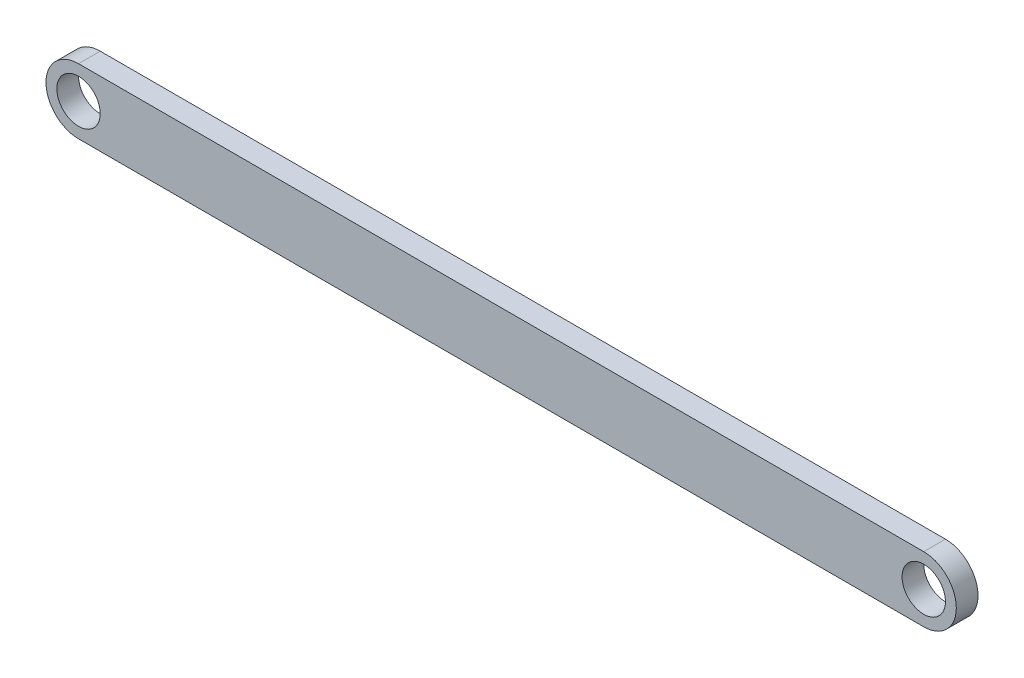
ISO-10303-21;
HEADER;
FILE_DESCRIPTION(('STEP AP214'),'2;1');
FILE_NAME('part.step','',(''),(''),'','','');
FILE_SCHEMA(('AUTOMOTIVE_DESIGN { 1 0 10303 214 1 1 1 1 }'));
ENDSEC;
DATA;
#1=APPLICATION_CONTEXT('core data for automotive mechanical design processes');
#2=APPLICATION_PROTOCOL_DEFINITION('international standard','automotive_design',2000,#1);
#3=PRODUCT_CONTEXT('',#1,'mechanical');
#4=PRODUCT('Part','Part','',(#3));
#5=PRODUCT_RELATED_PRODUCT_CATEGORY('part','',(#4));
#6=PRODUCT_DEFINITION_FORMATION('','',#4);
#7=PRODUCT_DEFINITION_CONTEXT('part definition',#1,'design');
#8=PRODUCT_DEFINITION('design','',#6,#7);
#9=PRODUCT_DEFINITION_SHAPE('','',#8);
#10=(LENGTH_UNIT() NAMED_UNIT(*) SI_UNIT(.MILLI.,.METRE.));
#11=(NAMED_UNIT(*) PLANE_ANGLE_UNIT() SI_UNIT($,.RADIAN.));
#12=(NAMED_UNIT(*) SI_UNIT($,.STERADIAN.) SOLID_ANGLE_UNIT());
#13=UNCERTAINTY_MEASURE_WITH_UNIT(LENGTH_MEASURE(1.E-05),#10,'distance_accuracy_value','');
#14=(GEOMETRIC_REPRESENTATION_CONTEXT(3) GLOBAL_UNCERTAINTY_ASSIGNED_CONTEXT((#13)) GLOBAL_UNIT_ASSIGNED_CONTEXT((#10,
#11,#12)) REPRESENTATION_CONTEXT('',''));
#15=CARTESIAN_POINT('',(0.,0.,0.));
#16=DIRECTION('',(0.,0.,1.));
#17=DIRECTION('',(1.,0.,0.));
#18=AXIS2_PLACEMENT_3D('',#15,#16,#17);
#19=CARTESIAN_POINT('',(0.,0.,0.5));
#20=DIRECTION('',(0.,0.,1.));
#21=DIRECTION('',(1.,0.,0.));
#22=AXIS2_PLACEMENT_3D('',#19,#20,#21);
#23=PLANE('',#22);
#24=CARTESIAN_POINT('',(-38.95,0.,0.5));
#25=DIRECTION('',(0.,0.,1.));
#26=DIRECTION('',(1.,0.,0.));
#27=AXIS2_PLACEMENT_3D('',#24,#25,#26);
#28=CIRCLE('',#27,0.999999999999998);
#29=CARTESIAN_POINT('',(-37.95,0.,0.5));
#30=VERTEX_POINT('',#29);
#31=EDGE_CURVE('E101',#30,#30,#28,.T.);
#32=ORIENTED_EDGE('',*,*,#31,.F.);
#33=EDGE_LOOP('',(#32));
#34=FACE_BOUND('',#33,.T.);
#35=CARTESIAN_POINT('',(0.,0.,0.5));
#36=DIRECTION('',(0.,0.,1.));
#37=DIRECTION('',(1.,0.,0.));
#38=AXIS2_PLACEMENT_3D('',#35,#36,#37);
#39=CIRCLE('',#38,1.5);
#40=CARTESIAN_POINT('',(0.,-1.5,0.5));
#41=VERTEX_POINT('',#40);
#42=CARTESIAN_POINT('',(0.,1.5,0.5));
#43=VERTEX_POINT('',#42);
#44=EDGE_CURVE('E86',#41,#43,#39,.T.);
#45=ORIENTED_EDGE('',*,*,#44,.T.);
#46=DIRECTION('',(-1.,0.,0.));
#47=VECTOR('',#46,1.);
#48=CARTESIAN_POINT('',(0.,1.5,0.5));
#49=LINE('',#48,#47);
#50=CARTESIAN_POINT('',(-38.95,1.5,0.5));
#51=VERTEX_POINT('',#50);
#52=EDGE_CURVE('E81',#43,#51,#49,.T.);
#53=ORIENTED_EDGE('',*,*,#52,.T.);
#54=CARTESIAN_POINT('',(-38.95,0.,0.5));
#55=DIRECTION('',(0.,0.,1.));
#56=DIRECTION('',(1.,0.,0.));
#57=AXIS2_PLACEMENT_3D('',#54,#55,#56);
#58=CIRCLE('',#57,1.5);
#59=CARTESIAN_POINT('',(-38.95,-1.5,0.5));
#60=VERTEX_POINT('',#59);
#61=EDGE_CURVE('E84',#51,#60,#58,.T.);
#62=ORIENTED_EDGE('',*,*,#61,.T.);
#63=DIRECTION('',(1.,0.,0.));
#64=VECTOR('',#63,1.);
#65=CARTESIAN_POINT('',(0.,-1.5,0.5));
#66=LINE('',#65,#64);
#67=EDGE_CURVE('E51',#60,#41,#66,.T.);
#68=ORIENTED_EDGE('',*,*,#67,.T.);
#69=EDGE_LOOP('',(#45,#53,#62,#68));
#70=FACE_BOUND('',#69,.T.);
#71=CARTESIAN_POINT('',(0.,0.,0.5));
#72=DIRECTION('',(0.,0.,1.));
#73=DIRECTION('',(1.,0.,0.));
#74=AXIS2_PLACEMENT_3D('',#71,#72,#73);
#75=CIRCLE('',#74,1.);
#76=CARTESIAN_POINT('',(1.,0.,0.5));
#77=VERTEX_POINT('',#76);
#78=EDGE_CURVE('E116',#77,#77,#75,.T.);
#79=ORIENTED_EDGE('',*,*,#78,.F.);
#80=EDGE_LOOP('',(#79));
#81=FACE_BOUND('',#80,.T.);
#82=ADVANCED_FACE('F34',(#34,#70,#81),#23,.T.);
#83=CARTESIAN_POINT('',(0.,0.,-0.5));
#84=DIRECTION('',(0.,0.,1.));
#85=DIRECTION('',(1.,0.,0.));
#86=AXIS2_PLACEMENT_3D('',#83,#84,#85);
#87=PLANE('',#86);
#88=CARTESIAN_POINT('',(0.,0.,-0.5));
#89=DIRECTION('',(0.,0.,1.));
#90=DIRECTION('',(1.,0.,0.));
#91=AXIS2_PLACEMENT_3D('',#88,#89,#90);
#92=CIRCLE('',#91,1.5);
#93=CARTESIAN_POINT('',(0.,-1.5,-0.5));
#94=VERTEX_POINT('',#93);
#95=CARTESIAN_POINT('',(0.,1.5,-0.5));
#96=VERTEX_POINT('',#95);
#97=EDGE_CURVE('E98',#94,#96,#92,.T.);
#98=ORIENTED_EDGE('',*,*,#97,.F.);
#99=DIRECTION('',(1.,0.,0.));
#100=VECTOR('',#99,1.);
#101=CARTESIAN_POINT('',(0.,-1.5,-0.5));
#102=LINE('',#101,#100);
#103=CARTESIAN_POINT('',(-38.95,-1.5,-0.5));
#104=VERTEX_POINT('',#103);
#105=EDGE_CURVE('E74',#104,#94,#102,.T.);
#106=ORIENTED_EDGE('',*,*,#105,.F.);
#107=CARTESIAN_POINT('',(-38.95,0.,-0.5));
#108=DIRECTION('',(0.,0.,1.));
#109=DIRECTION('',(1.,0.,0.));
#110=AXIS2_PLACEMENT_3D('',#107,#108,#109);
#111=CIRCLE('',#110,1.5);
#112=CARTESIAN_POINT('',(-38.95,1.5,-0.5));
#113=VERTEX_POINT('',#112);
#114=EDGE_CURVE('E68',#113,#104,#111,.T.);
#115=ORIENTED_EDGE('',*,*,#114,.F.);
#116=DIRECTION('',(-1.,0.,0.));
#117=VECTOR('',#116,1.);
#118=CARTESIAN_POINT('',(0.,1.5,-0.5));
#119=LINE('',#118,#117);
#120=EDGE_CURVE('E90',#96,#113,#119,.T.);
#121=ORIENTED_EDGE('',*,*,#120,.F.);
#122=EDGE_LOOP('',(#98,#106,#115,#121));
#123=FACE_BOUND('',#122,.T.);
#124=CARTESIAN_POINT('',(-38.95,0.,-0.5));
#125=DIRECTION('',(0.,0.,1.));
#126=DIRECTION('',(1.,0.,0.));
#127=AXIS2_PLACEMENT_3D('',#124,#125,#126);
#128=CIRCLE('',#127,0.999999999999998);
#129=CARTESIAN_POINT('',(-37.95,0.,-0.5));
#130=VERTEX_POINT('',#129);
#131=EDGE_CURVE('E113',#130,#130,#128,.T.);
#132=ORIENTED_EDGE('',*,*,#131,.T.);
#133=EDGE_LOOP('',(#132));
#134=FACE_BOUND('',#133,.T.);
#135=CARTESIAN_POINT('',(0.,0.,-0.5));
#136=DIRECTION('',(0.,0.,1.));
#137=DIRECTION('',(1.,0.,0.));
#138=AXIS2_PLACEMENT_3D('',#135,#136,#137);
#139=CIRCLE('',#138,1.);
#140=CARTESIAN_POINT('',(1.,0.,-0.5));
#141=VERTEX_POINT('',#140);
#142=EDGE_CURVE('E119',#141,#141,#139,.T.);
#143=ORIENTED_EDGE('',*,*,#142,.T.);
#144=EDGE_LOOP('',(#143));
#145=FACE_BOUND('',#144,.T.);
#146=ADVANCED_FACE('F109',(#123,#134,#145),#87,.F.);
#147=CARTESIAN_POINT('',(0.,0.,0.5));
#148=DIRECTION('',(0.,0.,-1.));
#149=DIRECTION('',(-1.,0.,0.));
#150=AXIS2_PLACEMENT_3D('',#147,#148,#149);
#151=CYLINDRICAL_SURFACE('',#150,1.5);
#152=ORIENTED_EDGE('',*,*,#97,.T.);
#153=DIRECTION('',(0.,0.,-1.));
#154=VECTOR('',#153,1.);
#155=CARTESIAN_POINT('',(0.,1.5,0.5));
#156=LINE('',#155,#154);
#157=EDGE_CURVE('E11',#43,#96,#156,.T.);
#158=ORIENTED_EDGE('',*,*,#157,.F.);
#159=ORIENTED_EDGE('',*,*,#44,.F.);
#160=DIRECTION('',(0.,0.,-1.));
#161=VECTOR('',#160,1.);
#162=CARTESIAN_POINT('',(0.,-1.5,0.5));
#163=LINE('',#162,#161);
#164=EDGE_CURVE('E94',#41,#94,#163,.T.);
#165=ORIENTED_EDGE('',*,*,#164,.T.);
#166=EDGE_LOOP('',(#152,#158,#159,#165));
#167=FACE_BOUND('',#166,.T.);
#168=ADVANCED_FACE('F36',(#167),#151,.T.);
#169=CARTESIAN_POINT('',(0.,1.5,0.5));
#170=DIRECTION('',(0.,-1.,0.));
#171=DIRECTION('',(1.,0.,0.));
#172=AXIS2_PLACEMENT_3D('',#169,#170,#171);
#173=PLANE('',#172);
#174=ORIENTED_EDGE('',*,*,#120,.T.);
#175=DIRECTION('',(0.,0.,-1.));
#176=VECTOR('',#175,1.);
#177=CARTESIAN_POINT('',(-38.95,1.5,0.5));
#178=LINE('',#177,#176);
#179=EDGE_CURVE('E43',#51,#113,#178,.T.);
#180=ORIENTED_EDGE('',*,*,#179,.F.);
#181=ORIENTED_EDGE('',*,*,#52,.F.);
#182=ORIENTED_EDGE('',*,*,#157,.T.);
#183=EDGE_LOOP('',(#174,#180,#181,#182));
#184=FACE_BOUND('',#183,.T.);
#185=ADVANCED_FACE('F89',(#184),#173,.F.);
#186=CARTESIAN_POINT('',(-38.95,0.,0.5));
#187=DIRECTION('',(0.,0.,-1.));
#188=DIRECTION('',(-1.,0.,0.));
#189=AXIS2_PLACEMENT_3D('',#186,#187,#188);
#190=CYLINDRICAL_SURFACE('',#189,1.5);
#191=ORIENTED_EDGE('',*,*,#114,.T.);
#192=DIRECTION('',(0.,0.,-1.));
#193=VECTOR('',#192,1.);
#194=CARTESIAN_POINT('',(-38.95,-1.5,0.5));
#195=LINE('',#194,#193);
#196=EDGE_CURVE('E91',#60,#104,#195,.T.);
#197=ORIENTED_EDGE('',*,*,#196,.F.);
#198=ORIENTED_EDGE('',*,*,#61,.F.);
#199=ORIENTED_EDGE('',*,*,#179,.T.);
#200=EDGE_LOOP('',(#191,#197,#198,#199));
#201=FACE_BOUND('',#200,.T.);
#202=ADVANCED_FACE('F92',(#201),#190,.T.);
#203=CARTESIAN_POINT('',(0.,-1.5,0.5));
#204=DIRECTION('',(0.,1.,0.));
#205=DIRECTION('',(0.,0.,1.));
#206=AXIS2_PLACEMENT_3D('',#203,#204,#205);
#207=PLANE('',#206);
#208=ORIENTED_EDGE('',*,*,#105,.T.);
#209=ORIENTED_EDGE('',*,*,#164,.F.);
#210=ORIENTED_EDGE('',*,*,#67,.F.);
#211=ORIENTED_EDGE('',*,*,#196,.T.);
#212=EDGE_LOOP('',(#208,#209,#210,#211));
#213=FACE_BOUND('',#212,.T.);
#214=ADVANCED_FACE('F106',(#213),#207,.F.);
#215=CARTESIAN_POINT('',(-38.95,0.,0.5));
#216=DIRECTION('',(0.,0.,-1.));
#217=DIRECTION('',(-1.,0.,0.));
#218=AXIS2_PLACEMENT_3D('',#215,#216,#217);
#219=CYLINDRICAL_SURFACE('',#218,0.999999999999998);
#220=ORIENTED_EDGE('',*,*,#31,.T.);
#221=EDGE_LOOP('',(#220));
#222=FACE_BOUND('',#221,.T.);
#223=ORIENTED_EDGE('',*,*,#131,.F.);
#224=EDGE_LOOP('',(#223));
#225=FACE_BOUND('',#224,.T.);
#226=ADVANCED_FACE('F136',(#222,#225),#219,.F.);
#227=CARTESIAN_POINT('',(0.,0.,0.5));
#228=DIRECTION('',(0.,0.,-1.));
#229=DIRECTION('',(-1.,0.,0.));
#230=AXIS2_PLACEMENT_3D('',#227,#228,#229);
#231=CYLINDRICAL_SURFACE('',#230,1.);
#232=ORIENTED_EDGE('',*,*,#78,.T.);
#233=EDGE_LOOP('',(#232));
#234=FACE_BOUND('',#233,.T.);
#235=ORIENTED_EDGE('',*,*,#142,.F.);
#236=EDGE_LOOP('',(#235));
#237=FACE_BOUND('',#236,.T.);
#238=ADVANCED_FACE('F125',(#234,#237),#231,.F.);
#239=CLOSED_SHELL('',(#82,#146,#168,#185,#202,#214,#226,#238));
#240=MANIFOLD_SOLID_BREP('B2',#239);
#241=ADVANCED_BREP_SHAPE_REPRESENTATION('',(#18,#240),#14);
#242=SHAPE_DEFINITION_REPRESENTATION(#9,#241);
ENDSEC;
END-ISO-10303-21;
